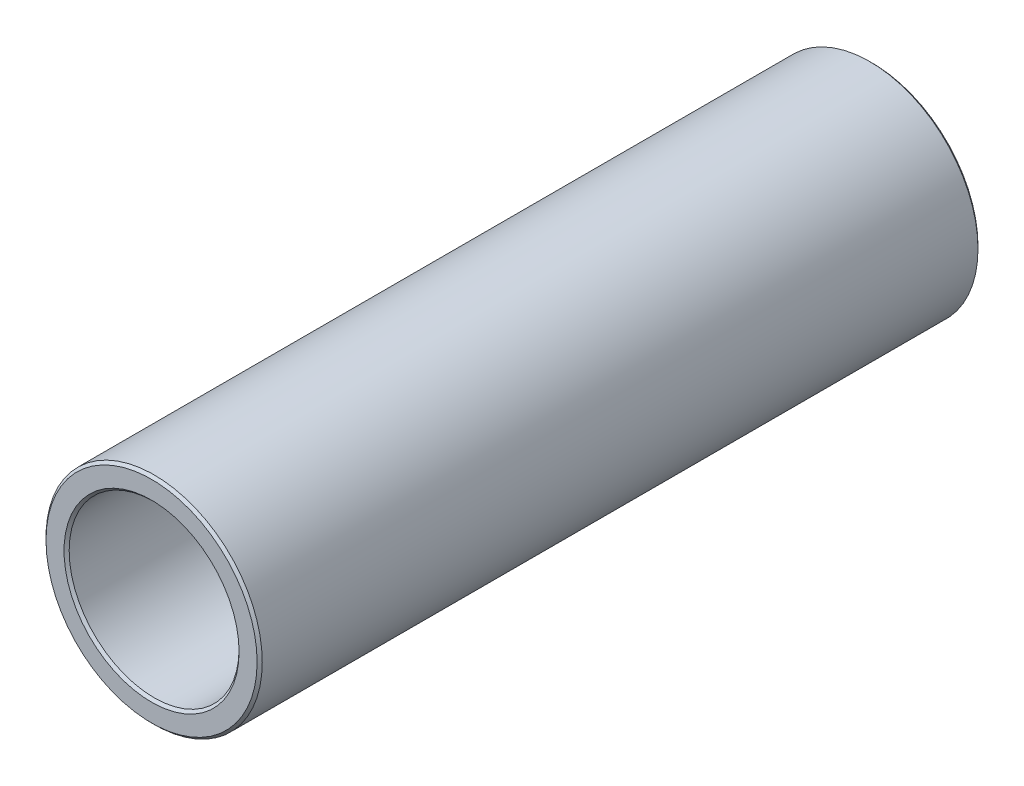
ISO-10303-21;
HEADER;
FILE_DESCRIPTION(('STEP AP214'),'2;1');
FILE_NAME('part.step','',(''),(''),'','','');
FILE_SCHEMA(('AUTOMOTIVE_DESIGN { 1 0 10303 214 1 1 1 1 }'));
ENDSEC;
DATA;
#1=APPLICATION_CONTEXT('core data for automotive mechanical design processes');
#2=APPLICATION_PROTOCOL_DEFINITION('international standard','automotive_design',2000,#1);
#3=PRODUCT_CONTEXT('',#1,'mechanical');
#4=PRODUCT('Part','Part','',(#3));
#5=PRODUCT_RELATED_PRODUCT_CATEGORY('part','',(#4));
#6=PRODUCT_DEFINITION_FORMATION('','',#4);
#7=PRODUCT_DEFINITION_CONTEXT('part definition',#1,'design');
#8=PRODUCT_DEFINITION('design','',#6,#7);
#9=PRODUCT_DEFINITION_SHAPE('','',#8);
#10=(LENGTH_UNIT() NAMED_UNIT(*) SI_UNIT(.MILLI.,.METRE.));
#11=(NAMED_UNIT(*) PLANE_ANGLE_UNIT() SI_UNIT($,.RADIAN.));
#12=(NAMED_UNIT(*) SI_UNIT($,.STERADIAN.) SOLID_ANGLE_UNIT());
#13=UNCERTAINTY_MEASURE_WITH_UNIT(LENGTH_MEASURE(1.E-05),#10,'distance_accuracy_value','');
#14=(GEOMETRIC_REPRESENTATION_CONTEXT(3) GLOBAL_UNCERTAINTY_ASSIGNED_CONTEXT((#13)) GLOBAL_UNIT_ASSIGNED_CONTEXT((#10,
#11,#12)) REPRESENTATION_CONTEXT('',''));
#15=CARTESIAN_POINT('',(0.,0.,0.));
#16=DIRECTION('',(0.,0.,1.));
#17=DIRECTION('',(1.,0.,0.));
#18=AXIS2_PLACEMENT_3D('',#15,#16,#17);
#19=CARTESIAN_POINT('',(1.2490009027033E-13,0.,140.));
#20=DIRECTION('',(0.,0.,-0.999999999999999));
#21=DIRECTION('',(-1.,0.,0.));
#22=AXIS2_PLACEMENT_3D('',#19,#20,#21);
#23=PLANE('',#22);
#24=CARTESIAN_POINT('',(1.2490009027033E-13,0.,140.));
#25=DIRECTION('',(0.,0.,0.999999999999999));
#26=DIRECTION('',(1.,0.,0.));
#27=AXIS2_PLACEMENT_3D('',#24,#25,#26);
#28=CIRCLE('',#27,20.5);
#29=CARTESIAN_POINT('',(20.5000000000001,0.,140.));
#30=VERTEX_POINT('',#29);
#31=EDGE_CURVE('E52',#30,#30,#28,.T.);
#32=ORIENTED_EDGE('',*,*,#31,.T.);
#33=EDGE_LOOP('',(#32));
#34=FACE_BOUND('',#33,.T.);
#35=CARTESIAN_POINT('',(1.2490009027033E-13,0.,140.));
#36=DIRECTION('',(0.,0.,0.999999999999999));
#37=DIRECTION('',(1.,0.,0.));
#38=AXIS2_PLACEMENT_3D('',#35,#36,#37);
#39=CIRCLE('',#38,17.);
#40=CARTESIAN_POINT('',(17.0000000000001,0.,140.));
#41=VERTEX_POINT('',#40);
#42=EDGE_CURVE('E74',#41,#41,#39,.T.);
#43=ORIENTED_EDGE('',*,*,#42,.F.);
#44=EDGE_LOOP('',(#43));
#45=FACE_BOUND('',#44,.T.);
#46=ADVANCED_FACE('F46',(#34,#45),#23,.F.);
#47=CARTESIAN_POINT('',(0.,21.0000000000001,0.));
#48=DIRECTION('',(0.,0.,0.999999999999999));
#49=DIRECTION('',(1.,0.,0.));
#50=AXIS2_PLACEMENT_3D('',#47,#48,#49);
#51=PLANE('',#50);
#52=CARTESIAN_POINT('',(0.,0.,0.));
#53=DIRECTION('',(0.,0.,0.999999999999999));
#54=DIRECTION('',(1.,0.,0.));
#55=AXIS2_PLACEMENT_3D('',#52,#53,#54);
#56=CIRCLE('',#55,20.5);
#57=CARTESIAN_POINT('',(20.5,0.,0.));
#58=VERTEX_POINT('',#57);
#59=EDGE_CURVE('E56',#58,#58,#56,.T.);
#60=ORIENTED_EDGE('',*,*,#59,.F.);
#61=EDGE_LOOP('',(#60));
#62=FACE_BOUND('',#61,.T.);
#63=CARTESIAN_POINT('',(0.,0.,0.));
#64=DIRECTION('',(0.,0.,0.999999999999999));
#65=DIRECTION('',(1.,0.,0.));
#66=AXIS2_PLACEMENT_3D('',#63,#64,#65);
#67=CIRCLE('',#66,8.);
#68=CARTESIAN_POINT('',(8.00000000000001,0.,0.));
#69=VERTEX_POINT('',#68);
#70=EDGE_CURVE('E71',#69,#69,#67,.T.);
#71=ORIENTED_EDGE('',*,*,#70,.T.);
#72=EDGE_LOOP('',(#71));
#73=FACE_BOUND('',#72,.T.);
#74=ADVANCED_FACE('F99',(#62,#73),#51,.F.);
#75=CARTESIAN_POINT('',(0.,0.,0.));
#76=DIRECTION('',(0.,0.,0.999999999999999));
#77=DIRECTION('',(1.,0.,0.));
#78=AXIS2_PLACEMENT_3D('',#75,#76,#77);
#79=CYLINDRICAL_SURFACE('',#78,21.);
#80=CARTESIAN_POINT('',(1.2490009027033E-13,0.,139.5));
#81=DIRECTION('',(0.,0.,0.999999999999999));
#82=DIRECTION('',(1.,0.,0.));
#83=AXIS2_PLACEMENT_3D('',#80,#81,#82);
#84=CIRCLE('',#83,21.);
#85=CARTESIAN_POINT('',(21.,0.,139.5));
#86=VERTEX_POINT('',#85);
#87=EDGE_CURVE('E12',#86,#86,#84,.T.);
#88=CARTESIAN_POINT('',(0.,0.,0.5));
#89=DIRECTION('',(0.,0.,0.999999999999999));
#90=DIRECTION('',(1.,0.,0.));
#91=AXIS2_PLACEMENT_3D('',#88,#89,#90);
#92=CIRCLE('',#91,21.);
#93=CARTESIAN_POINT('',(21.,0.,0.499999999999999));
#94=VERTEX_POINT('',#93);
#95=EDGE_CURVE('E60',#94,#94,#92,.T.);
#96=CARTESIAN_POINT('',(21.,0.,139.5));
#97=CARTESIAN_POINT('',(21.,0.,138.052083333333));
#98=CARTESIAN_POINT('',(21.,0.,136.604166666667));
#99=CARTESIAN_POINT('',(21.,0.,133.708333333333));
#100=CARTESIAN_POINT('',(21.,0.,132.260416666667));
#101=CARTESIAN_POINT('',(21.,0.,129.364583333333));
#102=CARTESIAN_POINT('',(21.,0.,127.916666666667));
#103=CARTESIAN_POINT('',(21.,0.,125.020833333333));
#104=CARTESIAN_POINT('',(21.,0.,123.572916666667));
#105=CARTESIAN_POINT('',(21.,0.,120.677083333333));
#106=CARTESIAN_POINT('',(21.,0.,119.229166666667));
#107=CARTESIAN_POINT('',(21.,0.,116.333333333333));
#108=CARTESIAN_POINT('',(21.,0.,114.885416666667));
#109=CARTESIAN_POINT('',(21.,0.,111.989583333333));
#110=CARTESIAN_POINT('',(21.,0.,110.541666666667));
#111=CARTESIAN_POINT('',(21.,0.,107.645833333333));
#112=CARTESIAN_POINT('',(21.,0.,106.197916666667));
#113=CARTESIAN_POINT('',(21.,0.,103.302083333333));
#114=CARTESIAN_POINT('',(21.,0.,101.854166666667));
#115=CARTESIAN_POINT('',(21.,0.,98.9583333333333));
#116=CARTESIAN_POINT('',(21.,0.,97.5104166666666));
#117=CARTESIAN_POINT('',(21.,0.,94.6145833333333));
#118=CARTESIAN_POINT('',(21.,0.,93.1666666666666));
#119=CARTESIAN_POINT('',(21.,0.,90.2708333333333));
#120=CARTESIAN_POINT('',(21.,0.,88.8229166666666));
#121=CARTESIAN_POINT('',(21.,0.,85.9270833333333));
#122=CARTESIAN_POINT('',(21.,0.,84.4791666666666));
#123=CARTESIAN_POINT('',(21.,0.,81.5833333333333));
#124=CARTESIAN_POINT('',(21.,0.,80.1354166666666));
#125=CARTESIAN_POINT('',(21.,0.,77.2395833333333));
#126=CARTESIAN_POINT('',(21.,0.,75.7916666666666));
#127=CARTESIAN_POINT('',(21.,0.,72.8958333333333));
#128=CARTESIAN_POINT('',(21.,0.,71.4479166666666));
#129=CARTESIAN_POINT('',(21.,0.,68.5520833333333));
#130=CARTESIAN_POINT('',(21.,0.,67.1041666666666));
#131=CARTESIAN_POINT('',(21.,0.,64.2083333333333));
#132=CARTESIAN_POINT('',(21.,0.,62.7604166666666));
#133=CARTESIAN_POINT('',(21.,0.,59.8645833333333));
#134=CARTESIAN_POINT('',(21.,0.,58.4166666666666));
#135=CARTESIAN_POINT('',(21.,0.,55.5208333333333));
#136=CARTESIAN_POINT('',(21.,0.,54.0729166666666));
#137=CARTESIAN_POINT('',(21.,0.,51.1770833333333));
#138=CARTESIAN_POINT('',(21.,0.,49.7291666666666));
#139=CARTESIAN_POINT('',(21.,0.,46.8333333333333));
#140=CARTESIAN_POINT('',(21.,0.,45.3854166666666));
#141=CARTESIAN_POINT('',(21.,0.,42.4895833333333));
#142=CARTESIAN_POINT('',(21.,0.,41.0416666666667));
#143=CARTESIAN_POINT('',(21.,0.,38.1458333333333));
#144=CARTESIAN_POINT('',(21.,0.,36.6979166666667));
#145=CARTESIAN_POINT('',(21.,0.,33.8020833333333));
#146=CARTESIAN_POINT('',(21.,0.,32.3541666666666));
#147=CARTESIAN_POINT('',(21.,0.,29.4583333333333));
#148=CARTESIAN_POINT('',(21.,0.,28.0104166666667));
#149=CARTESIAN_POINT('',(21.,0.,25.1145833333333));
#150=CARTESIAN_POINT('',(21.,0.,23.6666666666667));
#151=CARTESIAN_POINT('',(21.,0.,20.7708333333333));
#152=CARTESIAN_POINT('',(21.,0.,19.3229166666667));
#153=CARTESIAN_POINT('',(21.,0.,16.4270833333333));
#154=CARTESIAN_POINT('',(21.,0.,14.9791666666667));
#155=CARTESIAN_POINT('',(21.,0.,12.0833333333333));
#156=CARTESIAN_POINT('',(21.,0.,10.6354166666667));
#157=CARTESIAN_POINT('',(21.,0.,7.73958333333334));
#158=CARTESIAN_POINT('',(21.,0.,6.29166666666667));
#159=CARTESIAN_POINT('',(21.,0.,3.39583333333334));
#160=CARTESIAN_POINT('',(21.,0.,1.94791666666667));
#161=CARTESIAN_POINT('',(21.,0.,0.500000000000001));
#162=B_SPLINE_CURVE_WITH_KNOTS('',3,(#96,#97,#98,#99,#100,#101,#102,#103,#104,#105,#106,#107,
#108,#109,#110,#111,#112,#113,#114,#115,#116,#117,#118,#119,#120,#121,#122,#123,#124,#125,#126,
#127,#128,#129,#130,#131,#132,#133,#134,#135,#136,#137,#138,#139,#140,#141,#142,#143,#144,#145,
#146,#147,#148,#149,#150,#151,#152,#153,#154,#155,#156,#157,#158,#159,#160,#161),.UNSPECIFIED.,
.F.,.F.,(4,2,2,2,2,2,2,2,2,2,2,2,2,2,2,2,2,2,2,2,2,2,2,2,2,2,2,2,2,2,2,2,4),(0.,
4.34375000000001,8.68750000000001,13.03125,17.375,21.71875,26.0625,30.40625,34.75,39.09375,
43.4375,47.78125,52.125,56.46875,60.8125,65.15625,69.5,73.84375,78.1875,82.5312499999999,86.875,
91.21875,95.5624999999999,99.9062499999999,104.25,108.59375,112.9375,117.28125,121.625,
125.96875,130.3125,134.65625,139.),.UNSPECIFIED.);
#163=EDGE_CURVE('BSEAM103',#86,#94,#162,.T.);
#164=ORIENTED_EDGE('',*,*,#87,.F.);
#165=ORIENTED_EDGE('',*,*,#95,.T.);
#166=ORIENTED_EDGE('',*,*,#163,.T.);
#167=ORIENTED_EDGE('',*,*,#163,.F.);
#168=EDGE_LOOP('',(#164,#166,#165,#167));
#169=FACE_BOUND('',#168,.T.);
#170=ADVANCED_FACE('F103',(#169),#79,.T.);
#171=CARTESIAN_POINT('',(1.2490009027033E-13,0.,140.));
#172=DIRECTION('',(0.,0.,-0.999999999999999));
#173=DIRECTION('',(-1.,0.,0.));
#174=AXIS2_PLACEMENT_3D('',#171,#172,#173);
#175=CONICAL_SURFACE('',#174,20.5,0.785398163397448);
#176=ORIENTED_EDGE('',*,*,#87,.T.);
#177=EDGE_LOOP('',(#176));
#178=FACE_BOUND('',#177,.T.);
#179=ORIENTED_EDGE('',*,*,#31,.F.);
#180=EDGE_LOOP('',(#179));
#181=FACE_BOUND('',#180,.T.);
#182=ADVANCED_FACE('F113',(#178,#181),#175,.T.);
#183=CARTESIAN_POINT('',(0.,0.,0.5));
#184=DIRECTION('',(0.,0.,0.999999999999999));
#185=DIRECTION('',(1.,0.,0.));
#186=AXIS2_PLACEMENT_3D('',#183,#184,#185);
#187=CONICAL_SURFACE('',#186,21.,0.785398163397449);
#188=CARTESIAN_POINT('',(20.5,0.,0.));
#189=CARTESIAN_POINT('',(20.5052083333333,0.,0.0052083333333314));
#190=CARTESIAN_POINT('',(20.5104166666667,0.,0.0104166666666651));
#191=CARTESIAN_POINT('',(20.5208333333333,0.,0.0208333333333324));
#192=CARTESIAN_POINT('',(20.5260416666667,0.,0.0260416666666661));
#193=CARTESIAN_POINT('',(20.5364583333333,0.,0.0364583333333326));
#194=CARTESIAN_POINT('',(20.5416666666667,0.,0.0416666666666654));
#195=CARTESIAN_POINT('',(20.5520833333333,0.,0.0520833333333321));
#196=CARTESIAN_POINT('',(20.5572916666667,0.,0.057291666666666));
#197=CARTESIAN_POINT('',(20.5677083333333,0.,0.0677083333333326));
#198=CARTESIAN_POINT('',(20.5729166666667,0.,0.0729166666666654));
#199=CARTESIAN_POINT('',(20.5833333333333,0.,0.0833333333333321));
#200=CARTESIAN_POINT('',(20.5885416666667,0.,0.088541666666666));
#201=CARTESIAN_POINT('',(20.5989583333333,0.,0.0989583333333327));
#202=CARTESIAN_POINT('',(20.6041666666667,0.,0.104166666666665));
#203=CARTESIAN_POINT('',(20.6145833333333,0.,0.114583333333332));
#204=CARTESIAN_POINT('',(20.6197916666667,0.,0.119791666666666));
#205=CARTESIAN_POINT('',(20.6302083333333,0.,0.130208333333333));
#206=CARTESIAN_POINT('',(20.6354166666667,0.,0.135416666666665));
#207=CARTESIAN_POINT('',(20.6458333333333,0.,0.145833333333332));
#208=CARTESIAN_POINT('',(20.6510416666667,0.,0.151041666666666));
#209=CARTESIAN_POINT('',(20.6614583333333,0.,0.161458333333333));
#210=CARTESIAN_POINT('',(20.6666666666667,0.,0.166666666666666));
#211=CARTESIAN_POINT('',(20.6770833333333,0.,0.177083333333332));
#212=CARTESIAN_POINT('',(20.6822916666667,0.,0.182291666666666));
#213=CARTESIAN_POINT('',(20.6927083333333,0.,0.192708333333333));
#214=CARTESIAN_POINT('',(20.6979166666667,0.,0.197916666666666));
#215=CARTESIAN_POINT('',(20.7083333333333,0.,0.208333333333332));
#216=CARTESIAN_POINT('',(20.7135416666667,0.,0.213541666666666));
#217=CARTESIAN_POINT('',(20.7239583333333,0.,0.223958333333333));
#218=CARTESIAN_POINT('',(20.7291666666667,0.,0.229166666666666));
#219=CARTESIAN_POINT('',(20.7395833333333,0.,0.239583333333332));
#220=CARTESIAN_POINT('',(20.7447916666667,0.,0.244791666666666));
#221=CARTESIAN_POINT('',(20.7552083333333,0.,0.255208333333333));
#222=CARTESIAN_POINT('',(20.7604166666667,0.,0.260416666666666));
#223=CARTESIAN_POINT('',(20.7708333333333,0.,0.270833333333332));
#224=CARTESIAN_POINT('',(20.7760416666667,0.,0.276041666666666));
#225=CARTESIAN_POINT('',(20.7864583333333,0.,0.286458333333333));
#226=CARTESIAN_POINT('',(20.7916666666667,0.,0.291666666666666));
#227=CARTESIAN_POINT('',(20.8020833333333,0.,0.302083333333332));
#228=CARTESIAN_POINT('',(20.8072916666667,0.,0.307291666666666));
#229=CARTESIAN_POINT('',(20.8177083333333,0.,0.317708333333333));
#230=CARTESIAN_POINT('',(20.8229166666667,0.,0.322916666666666));
#231=CARTESIAN_POINT('',(20.8333333333333,0.,0.333333333333332));
#232=CARTESIAN_POINT('',(20.8385416666667,0.,0.338541666666666));
#233=CARTESIAN_POINT('',(20.8489583333333,0.,0.348958333333333));
#234=CARTESIAN_POINT('',(20.8541666666667,0.,0.354166666666666));
#235=CARTESIAN_POINT('',(20.8645833333333,0.,0.364583333333332));
#236=CARTESIAN_POINT('',(20.8697916666667,0.,0.369791666666666));
#237=CARTESIAN_POINT('',(20.8802083333333,0.,0.380208333333333));
#238=CARTESIAN_POINT('',(20.8854166666667,0.,0.385416666666666));
#239=CARTESIAN_POINT('',(20.8958333333333,0.,0.395833333333332));
#240=CARTESIAN_POINT('',(20.9010416666667,0.,0.401041666666666));
#241=CARTESIAN_POINT('',(20.9114583333333,0.,0.411458333333333));
#242=CARTESIAN_POINT('',(20.9166666666667,0.,0.416666666666666));
#243=CARTESIAN_POINT('',(20.9270833333333,0.,0.427083333333332));
#244=CARTESIAN_POINT('',(20.9322916666667,0.,0.432291666666666));
#245=CARTESIAN_POINT('',(20.9427083333333,0.,0.442708333333333));
#246=CARTESIAN_POINT('',(20.9479166666667,0.,0.447916666666666));
#247=CARTESIAN_POINT('',(20.9583333333333,0.,0.458333333333332));
#248=CARTESIAN_POINT('',(20.9635416666667,0.,0.463541666666666));
#249=CARTESIAN_POINT('',(20.9739583333333,0.,0.473958333333333));
#250=CARTESIAN_POINT('',(20.9791666666667,0.,0.479166666666666));
#251=CARTESIAN_POINT('',(20.9895833333333,0.,0.489583333333332));
#252=CARTESIAN_POINT('',(20.9947916666667,0.,0.494791666666665));
#253=CARTESIAN_POINT('',(21.,0.,0.499999999999999));
#254=B_SPLINE_CURVE_WITH_KNOTS('',3,(#188,#189,#190,#191,#192,#193,#194,#195,#196,#197,#198,
#199,#200,#201,#202,#203,#204,#205,#206,#207,#208,#209,#210,#211,#212,#213,#214,#215,#216,#217,
#218,#219,#220,#221,#222,#223,#224,#225,#226,#227,#228,#229,#230,#231,#232,#233,#234,#235,#236,
#237,#238,#239,#240,#241,#242,#243,#244,#245,#246,#247,#248,#249,#250,#251,#252,#253),
.UNSPECIFIED.,.F.,.F.,(4,2,2,2,2,2,2,2,2,2,2,2,2,2,2,2,2,2,2,2,2,2,2,2,2,2,2,2,2,2,2,2,4),(0.,
0.0220970869120809,0.0441941738241593,0.0662912607362401,0.0883883476483185,0.110485434560399,
0.132582521472478,0.154679608384559,0.176776695296637,0.198873782208718,0.220970869120796,
0.243067956032877,0.265165042944956,0.287262129857036,0.309359216769115,0.331456303681196,
0.353553390593274,0.375650477505355,0.397747564417433,0.419844651329514,0.441941738241592,
0.464038825153673,0.486135912065752,0.508232998977832,0.530330085889911,0.552427172801992,
0.57452425971407,0.596621346626151,0.61871843353823,0.64081552045031,0.662912607362389,
0.685009694274469,0.707106781186548),.UNSPECIFIED.);
#255=EDGE_CURVE('BSEAM120',#58,#94,#254,.T.);
#256=ORIENTED_EDGE('',*,*,#59,.T.);
#257=ORIENTED_EDGE('',*,*,#95,.F.);
#258=ORIENTED_EDGE('',*,*,#255,.T.);
#259=ORIENTED_EDGE('',*,*,#255,.F.);
#260=EDGE_LOOP('',(#256,#258,#257,#259));
#261=FACE_BOUND('',#260,.T.);
#262=ADVANCED_FACE('F120',(#261),#187,.T.);
#263=CARTESIAN_POINT('',(1.11022302462516E-13,-1.11022302462516E-13,11.9175));
#264=DIRECTION('',(0.,0.,0.999999999999999));
#265=DIRECTION('',(1.,0.,0.));
#266=AXIS2_PLACEMENT_3D('',#263,#264,#265);
#267=CONICAL_SURFACE('',#266,6.9175,1.45830687177095);
#268=CARTESIAN_POINT('',(1.11022302462516E-13,-1.11022302462516E-13,13.));
#269=DIRECTION('',(0.,0.,0.999999999999999));
#270=DIRECTION('',(1.,0.,0.));
#271=AXIS2_PLACEMENT_3D('',#268,#269,#270);
#272=CIRCLE('',#271,16.5);
#273=CARTESIAN_POINT('',(16.5,-1.09189152578439E-13,13.));
#274=VERTEX_POINT('',#273);
#275=EDGE_CURVE('E80',#274,#274,#272,.T.);
#276=CARTESIAN_POINT('',(1.11022302462516E-13,-1.11022302462516E-13,11.9175));
#277=DIRECTION('',(0.,0.,0.999999999999999));
#278=DIRECTION('',(1.,0.,0.));
#279=AXIS2_PLACEMENT_3D('',#276,#277,#278);
#280=CIRCLE('',#279,6.9175);
#281=CARTESIAN_POINT('',(6.91750000000011,-1.10254305685231E-13,11.9175));
#282=VERTEX_POINT('',#281);
#283=EDGE_CURVE('E65',#282,#282,#280,.T.);
#284=CARTESIAN_POINT('',(16.5,-1.09189152578439E-13,13.));
#285=CARTESIAN_POINT('',(16.4001822916667,-1.09200247923301E-13,12.9887239583333));
#286=CARTESIAN_POINT('',(16.3003645833333,-1.09211343268164E-13,12.9774479166667));
#287=CARTESIAN_POINT('',(16.1007291666667,-1.09233533957888E-13,12.9548958333333));
#288=CARTESIAN_POINT('',(16.0009114583333,-1.09244629302751E-13,12.9436197916667));
#289=CARTESIAN_POINT('',(15.8012760416667,-1.09266819992476E-13,12.9210677083333));
#290=CARTESIAN_POINT('',(15.7014583333333,-1.09277915337338E-13,12.9097916666667));
#291=CARTESIAN_POINT('',(15.5018229166667,-1.09300106027063E-13,12.8872395833333));
#292=CARTESIAN_POINT('',(15.4020052083333,-1.09311201371925E-13,12.8759635416667));
#293=CARTESIAN_POINT('',(15.2023697916667,-1.0933339206165E-13,12.8534114583333));
#294=CARTESIAN_POINT('',(15.1025520833333,-1.09344487406513E-13,12.8421354166667));
#295=CARTESIAN_POINT('',(14.9029166666667,-1.09366678096237E-13,12.8195833333333));
#296=CARTESIAN_POINT('',(14.8030989583334,-1.093777734411E-13,12.8083072916667));
#297=CARTESIAN_POINT('',(14.6034635416667,-1.09399964130825E-13,12.7857552083333));
#298=CARTESIAN_POINT('',(14.5036458333334,-1.09411059475687E-13,12.7744791666667));
#299=CARTESIAN_POINT('',(14.3040104166667,-1.09433250165412E-13,12.7519270833333));
#300=CARTESIAN_POINT('',(14.2041927083334,-1.09444345510274E-13,12.7406510416667));
#301=CARTESIAN_POINT('',(14.0045572916667,-1.09466536199999E-13,12.7180989583333));
#302=CARTESIAN_POINT('',(13.9047395833334,-1.09477631544862E-13,12.7068229166667));
#303=CARTESIAN_POINT('',(13.7051041666667,-1.09499822234587E-13,12.6842708333333));
#304=CARTESIAN_POINT('',(13.6052864583334,-1.09510917579449E-13,12.6729947916667));
#305=CARTESIAN_POINT('',(13.4056510416667,-1.09533108269174E-13,12.6504427083333));
#306=CARTESIAN_POINT('',(13.3058333333334,-1.09544203614036E-13,12.6391666666667));
#307=CARTESIAN_POINT('',(13.1061979166667,-1.09566394303761E-13,12.6166145833333));
#308=CARTESIAN_POINT('',(13.0063802083334,-1.09577489648623E-13,12.6053385416667));
#309=CARTESIAN_POINT('',(12.8067447916667,-1.09599680338348E-13,12.5827864583333));
#310=CARTESIAN_POINT('',(12.7069270833334,-1.09610775683211E-13,12.5715104166667));
#311=CARTESIAN_POINT('',(12.5072916666667,-1.09632966372936E-13,12.5489583333333));
#312=CARTESIAN_POINT('',(12.4074739583334,-1.09644061717798E-13,12.5376822916667));
#313=CARTESIAN_POINT('',(12.2078385416667,-1.09666252407523E-13,12.5151302083333));
#314=CARTESIAN_POINT('',(12.1080208333334,-1.09677347752385E-13,12.5038541666667));
#315=CARTESIAN_POINT('',(11.9083854166667,-1.0969953844211E-13,12.4813020833334));
#316=CARTESIAN_POINT('',(11.8085677083334,-1.09710633786973E-13,12.4700260416667));
#317=CARTESIAN_POINT('',(11.6089322916667,-1.09732824476697E-13,12.4474739583334));
#318=CARTESIAN_POINT('',(11.5091145833334,-1.0974391982156E-13,12.4361979166667));
#319=CARTESIAN_POINT('',(11.3094791666667,-1.09766110511285E-13,12.4136458333334));
#320=CARTESIAN_POINT('',(11.2096614583334,-1.09777205856147E-13,12.4023697916667));
#321=CARTESIAN_POINT('',(11.0100260416667,-1.09799396545872E-13,12.3798177083334));
#322=CARTESIAN_POINT('',(10.9102083333334,-1.09810491890734E-13,12.3685416666667));
#323=CARTESIAN_POINT('',(10.7105729166667,-1.09832682580459E-13,12.3459895833334));
#324=CARTESIAN_POINT('',(10.6107552083334,-1.09843777925322E-13,12.3347135416667));
#325=CARTESIAN_POINT('',(10.4111197916667,-1.09865968615046E-13,12.3121614583334));
#326=CARTESIAN_POINT('',(10.3113020833334,-1.09877063959909E-13,12.3008854166667));
#327=CARTESIAN_POINT('',(10.1116666666667,-1.09899254649634E-13,12.2783333333334));
#328=CARTESIAN_POINT('',(10.0118489583334,-1.09910349994496E-13,12.2670572916667));
#329=CARTESIAN_POINT('',(9.81221354166674,-1.09932540684221E-13,12.2445052083334));
#330=CARTESIAN_POINT('',(9.71239583333341,-1.09943636029083E-13,12.2332291666667));
#331=CARTESIAN_POINT('',(9.51276041666675,-1.09965826718808E-13,12.2106770833334));
#332=CARTESIAN_POINT('',(9.41294270833341,-1.09976922063671E-13,12.1994010416667));
#333=CARTESIAN_POINT('',(9.21330729166675,-1.09999112753395E-13,12.1768489583334));
#334=CARTESIAN_POINT('',(9.11348958333342,-1.10010208098258E-13,12.1655729166667));
#335=CARTESIAN_POINT('',(8.91385416666675,-1.10032398787983E-13,12.1430208333334));
#336=CARTESIAN_POINT('',(8.81403645833342,-1.10043494132845E-13,12.1317447916667));
#337=CARTESIAN_POINT('',(8.61440104166676,-1.1006568482257E-13,12.1091927083334));
#338=CARTESIAN_POINT('',(8.51458333333342,-1.10076780167432E-13,12.0979166666667));
#339=CARTESIAN_POINT('',(8.31494791666676,-1.10098970857157E-13,12.0753645833334));
#340=CARTESIAN_POINT('',(8.21513020833343,-1.1011006620202E-13,12.0640885416667));
#341=CARTESIAN_POINT('',(8.01549479166676,-1.10132256891745E-13,12.0415364583334));
#342=CARTESIAN_POINT('',(7.91567708333343,-1.10143352236607E-13,12.0302604166667));
#343=CARTESIAN_POINT('',(7.71604166666677,-1.10165542926332E-13,12.0077083333334));
#344=CARTESIAN_POINT('',(7.61622395833343,-1.10176638271194E-13,11.9964322916667));
#345=CARTESIAN_POINT('',(7.41658854166677,-1.10198828960919E-13,11.9738802083334));
#346=CARTESIAN_POINT('',(7.31677083333344,-1.10209924305782E-13,11.9626041666667));
#347=CARTESIAN_POINT('',(7.11713541666677,-1.10232114995506E-13,11.9400520833334));
#348=CARTESIAN_POINT('',(7.01731770833344,-1.10243210340369E-13,11.9287760416667));
#349=CARTESIAN_POINT('',(6.91750000000011,-1.10254305685231E-13,11.9175));
#350=B_SPLINE_CURVE_WITH_KNOTS('',3,(#284,#285,#286,#287,#288,#289,#290,#291,#292,#293,#294,
#295,#296,#297,#298,#299,#300,#301,#302,#303,#304,#305,#306,#307,#308,#309,#310,#311,#312,#313,
#314,#315,#316,#317,#318,#319,#320,#321,#322,#323,#324,#325,#326,#327,#328,#329,#330,#331,#332,
#333,#334,#335,#336,#337,#338,#339,#340,#341,#342,#343,#344,#345,#346,#347,#348,#349),
.UNSPECIFIED.,.F.,.F.,(4,2,2,2,2,2,2,2,2,2,2,2,2,2,2,2,2,2,2,2,2,2,2,2,2,2,2,2,2,2,2,2,4),(0.,
0.301357787543777,0.60271557508755,0.904073362631323,1.2054311501751,1.50678893771887,
1.80814672526265,2.10950451280642,2.4108623003502,2.71222008789398,3.01357787543775,
3.31493566298153,3.6162934505253,3.91765123806908,4.21900902561285,4.52036681315663,
4.8217246007004,5.12308238824418,5.42444017578795,5.72579796333173,6.02715575087551,
6.32851353841928,6.62987132596306,6.93122911350683,7.23258690105061,7.53394468859438,
7.83530247613816,8.13666026368193,8.43801805122571,8.73937583876948,9.04073362631326,
9.34209141385704,9.64344920140081),.UNSPECIFIED.);
#351=EDGE_CURVE('BSEAM84',#274,#282,#350,.T.);
#352=ORIENTED_EDGE('',*,*,#275,.T.);
#353=ORIENTED_EDGE('',*,*,#283,.F.);
#354=ORIENTED_EDGE('',*,*,#351,.T.);
#355=ORIENTED_EDGE('',*,*,#351,.F.);
#356=EDGE_LOOP('',(#352,#354,#353,#355));
#357=FACE_BOUND('',#356,.T.);
#358=ADVANCED_FACE('F84',(#357),#267,.F.);
#359=CARTESIAN_POINT('',(0.,0.,0.));
#360=DIRECTION('',(0.,0.,0.999999999999999));
#361=DIRECTION('',(1.,0.,0.));
#362=AXIS2_PLACEMENT_3D('',#359,#360,#361);
#363=CYLINDRICAL_SURFACE('',#362,6.9175);
#364=CARTESIAN_POINT('',(0.,0.,1.08249999999999));
#365=DIRECTION('',(0.,0.,0.999999999999999));
#366=DIRECTION('',(1.,0.,0.));
#367=AXIS2_PLACEMENT_3D('',#364,#365,#366);
#368=CIRCLE('',#367,6.9175);
#369=CARTESIAN_POINT('',(6.9175,0.,1.08249999999999));
#370=VERTEX_POINT('',#369);
#371=EDGE_CURVE('E68',#370,#370,#368,.T.);
#372=CARTESIAN_POINT('',(6.91750000000001,0.,11.9175));
#373=CARTESIAN_POINT('',(6.91750000000001,0.,11.8046354166667));
#374=CARTESIAN_POINT('',(6.91750000000001,0.,11.6917708333334));
#375=CARTESIAN_POINT('',(6.91750000000001,0.,11.4660416666667));
#376=CARTESIAN_POINT('',(6.91750000000001,0.,11.3531770833334));
#377=CARTESIAN_POINT('',(6.91750000000001,0.,11.1274479166667));
#378=CARTESIAN_POINT('',(6.91750000000001,0.,11.0145833333334));
#379=CARTESIAN_POINT('',(6.91750000000001,0.,10.7888541666667));
#380=CARTESIAN_POINT('',(6.91750000000001,0.,10.6759895833334));
#381=CARTESIAN_POINT('',(6.91750000000001,0.,10.4502604166667));
#382=CARTESIAN_POINT('',(6.91750000000001,0.,10.3373958333334));
#383=CARTESIAN_POINT('',(6.91750000000001,0.,10.1116666666667));
#384=CARTESIAN_POINT('',(6.91750000000001,0.,9.99880208333335));
#385=CARTESIAN_POINT('',(6.91750000000001,0.,9.77307291666668));
#386=CARTESIAN_POINT('',(6.91750000000001,0.,9.66020833333335));
#387=CARTESIAN_POINT('',(6.91750000000001,0.,9.43447916666668));
#388=CARTESIAN_POINT('',(6.91750000000001,0.,9.32161458333335));
#389=CARTESIAN_POINT('',(6.91750000000001,0.,9.09588541666668));
#390=CARTESIAN_POINT('',(6.91750000000001,0.,8.98302083333335));
#391=CARTESIAN_POINT('',(6.91750000000001,0.,8.75729166666668));
#392=CARTESIAN_POINT('',(6.91750000000001,0.,8.64442708333335));
#393=CARTESIAN_POINT('',(6.91750000000001,0.,8.41869791666668));
#394=CARTESIAN_POINT('',(6.9175,0.,8.30583333333334));
#395=CARTESIAN_POINT('',(6.9175,0.,8.08010416666668));
#396=CARTESIAN_POINT('',(6.9175,0.,7.96723958333334));
#397=CARTESIAN_POINT('',(6.9175,0.,7.74151041666668));
#398=CARTESIAN_POINT('',(6.9175,0.,7.62864583333334));
#399=CARTESIAN_POINT('',(6.9175,0.,7.40291666666668));
#400=CARTESIAN_POINT('',(6.9175,0.,7.29005208333334));
#401=CARTESIAN_POINT('',(6.9175,0.,7.06432291666667));
#402=CARTESIAN_POINT('',(6.9175,0.,6.95145833333334));
#403=CARTESIAN_POINT('',(6.9175,0.,6.72572916666667));
#404=CARTESIAN_POINT('',(6.9175,0.,6.61286458333334));
#405=CARTESIAN_POINT('',(6.9175,0.,6.38713541666667));
#406=CARTESIAN_POINT('',(6.9175,0.,6.27427083333334));
#407=CARTESIAN_POINT('',(6.9175,0.,6.04854166666667));
#408=CARTESIAN_POINT('',(6.9175,0.,5.93567708333334));
#409=CARTESIAN_POINT('',(6.9175,0.,5.70994791666667));
#410=CARTESIAN_POINT('',(6.9175,0.,5.59708333333333));
#411=CARTESIAN_POINT('',(6.9175,0.,5.37135416666667));
#412=CARTESIAN_POINT('',(6.9175,0.,5.25848958333333));
#413=CARTESIAN_POINT('',(6.9175,0.,5.03276041666667));
#414=CARTESIAN_POINT('',(6.9175,0.,4.91989583333333));
#415=CARTESIAN_POINT('',(6.9175,0.,4.69416666666667));
#416=CARTESIAN_POINT('',(6.9175,0.,4.58130208333333));
#417=CARTESIAN_POINT('',(6.9175,0.,4.35557291666666));
#418=CARTESIAN_POINT('',(6.9175,0.,4.24270833333333));
#419=CARTESIAN_POINT('',(6.9175,0.,4.01697916666666));
#420=CARTESIAN_POINT('',(6.9175,0.,3.90411458333333));
#421=CARTESIAN_POINT('',(6.9175,0.,3.67838541666666));
#422=CARTESIAN_POINT('',(6.9175,0.,3.56552083333333));
#423=CARTESIAN_POINT('',(6.9175,0.,3.33979166666666));
#424=CARTESIAN_POINT('',(6.9175,0.,3.22692708333333));
#425=CARTESIAN_POINT('',(6.9175,0.,3.00119791666666));
#426=CARTESIAN_POINT('',(6.9175,0.,2.88833333333333));
#427=CARTESIAN_POINT('',(6.9175,0.,2.66260416666666));
#428=CARTESIAN_POINT('',(6.9175,0.,2.54973958333332));
#429=CARTESIAN_POINT('',(6.9175,0.,2.32401041666666));
#430=CARTESIAN_POINT('',(6.9175,0.,2.21114583333332));
#431=CARTESIAN_POINT('',(6.9175,0.,1.98541666666666));
#432=CARTESIAN_POINT('',(6.9175,0.,1.87255208333332));
#433=CARTESIAN_POINT('',(6.9175,0.,1.64682291666665));
#434=CARTESIAN_POINT('',(6.9175,0.,1.53395833333332));
#435=CARTESIAN_POINT('',(6.9175,0.,1.30822916666665));
#436=CARTESIAN_POINT('',(6.9175,0.,1.19536458333332));
#437=CARTESIAN_POINT('',(6.9175,0.,1.08249999999999));
#438=B_SPLINE_CURVE_WITH_KNOTS('',3,(#372,#373,#374,#375,#376,#377,#378,#379,#380,#381,#382,
#383,#384,#385,#386,#387,#388,#389,#390,#391,#392,#393,#394,#395,#396,#397,#398,#399,#400,#401,
#402,#403,#404,#405,#406,#407,#408,#409,#410,#411,#412,#413,#414,#415,#416,#417,#418,#419,#420,
#421,#422,#423,#424,#425,#426,#427,#428,#429,#430,#431,#432,#433,#434,#435,#436,#437),
.UNSPECIFIED.,.F.,.F.,(4,2,2,2,2,2,2,2,2,2,2,2,2,2,2,2,2,2,2,2,2,2,2,2,2,2,2,2,2,2,2,2,4),(0.,
0.338593749999999,0.677187500000001,1.01578125,1.354375,1.69296875000001,2.03156250000001,
2.37015625000001,2.70875000000001,3.04734375000001,3.38593750000001,3.72453125000001,
4.06312500000001,4.40171875000001,4.74031250000002,5.07890625000002,5.41750000000002,
5.75609375000002,6.09468750000002,6.43328125000002,6.77187500000002,7.11046875000002,
7.44906250000003,7.78765625000003,8.12625000000003,8.46484375000003,8.80343750000003,
9.14203125000003,9.48062500000003,9.81921875000003,10.1578125,10.49640625,10.835),.UNSPECIFIED.);
#439=EDGE_CURVE('BSEAM126',#282,#370,#438,.T.);
#440=ORIENTED_EDGE('',*,*,#283,.T.);
#441=ORIENTED_EDGE('',*,*,#371,.F.);
#442=ORIENTED_EDGE('',*,*,#439,.T.);
#443=ORIENTED_EDGE('',*,*,#439,.F.);
#444=EDGE_LOOP('',(#440,#442,#441,#443));
#445=FACE_BOUND('',#444,.T.);
#446=ADVANCED_FACE('F126',(#445),#363,.F.);
#447=CARTESIAN_POINT('',(0.,0.,0.));
#448=DIRECTION('',(0.,0.,-0.999999999999999));
#449=DIRECTION('',(-1.,0.,0.));
#450=AXIS2_PLACEMENT_3D('',#447,#448,#449);
#451=CONICAL_SURFACE('',#450,8.,0.785398163397448);
#452=ORIENTED_EDGE('',*,*,#371,.T.);
#453=EDGE_LOOP('',(#452));
#454=FACE_BOUND('',#453,.T.);
#455=ORIENTED_EDGE('',*,*,#70,.F.);
#456=EDGE_LOOP('',(#455));
#457=FACE_BOUND('',#456,.T.);
#458=ADVANCED_FACE('F95',(#454,#457),#451,.F.);
#459=CARTESIAN_POINT('',(1.2490009027033E-13,0.,139.5));
#460=DIRECTION('',(0.,0.,0.999999999999999));
#461=DIRECTION('',(1.,0.,0.));
#462=AXIS2_PLACEMENT_3D('',#459,#460,#461);
#463=CONICAL_SURFACE('',#462,16.5,0.785398163397448);
#464=CARTESIAN_POINT('',(1.2490009027033E-13,0.,139.5));
#465=DIRECTION('',(0.,0.,0.999999999999999));
#466=DIRECTION('',(1.,0.,0.));
#467=AXIS2_PLACEMENT_3D('',#464,#465,#466);
#468=CIRCLE('',#467,16.5);
#469=CARTESIAN_POINT('',(16.5000000000001,0.,139.5));
#470=VERTEX_POINT('',#469);
#471=EDGE_CURVE('E77',#470,#470,#468,.T.);
#472=CARTESIAN_POINT('',(17.0000000000001,0.,140.));
#473=CARTESIAN_POINT('',(16.9947916666668,0.,139.994791666667));
#474=CARTESIAN_POINT('',(16.9895833333335,0.,139.989583333333));
#475=CARTESIAN_POINT('',(16.9791666666668,0.,139.979166666667));
#476=CARTESIAN_POINT('',(16.9739583333335,0.,139.973958333333));
#477=CARTESIAN_POINT('',(16.9635416666668,0.,139.963541666667));
#478=CARTESIAN_POINT('',(16.9583333333335,0.,139.958333333333));
#479=CARTESIAN_POINT('',(16.9479166666668,0.,139.947916666667));
#480=CARTESIAN_POINT('',(16.9427083333335,0.,139.942708333333));
#481=CARTESIAN_POINT('',(16.9322916666668,0.,139.932291666667));
#482=CARTESIAN_POINT('',(16.9270833333335,0.,139.927083333333));
#483=CARTESIAN_POINT('',(16.9166666666668,0.,139.916666666667));
#484=CARTESIAN_POINT('',(16.9114583333335,0.,139.911458333333));
#485=CARTESIAN_POINT('',(16.9010416666668,0.,139.901041666667));
#486=CARTESIAN_POINT('',(16.8958333333335,0.,139.895833333333));
#487=CARTESIAN_POINT('',(16.8854166666668,0.,139.885416666667));
#488=CARTESIAN_POINT('',(16.8802083333335,0.,139.880208333333));
#489=CARTESIAN_POINT('',(16.8697916666668,0.,139.869791666667));
#490=CARTESIAN_POINT('',(16.8645833333335,0.,139.864583333333));
#491=CARTESIAN_POINT('',(16.8541666666668,0.,139.854166666667));
#492=CARTESIAN_POINT('',(16.8489583333335,0.,139.848958333333));
#493=CARTESIAN_POINT('',(16.8385416666668,0.,139.838541666667));
#494=CARTESIAN_POINT('',(16.8333333333335,0.,139.833333333333));
#495=CARTESIAN_POINT('',(16.8229166666668,0.,139.822916666667));
#496=CARTESIAN_POINT('',(16.8177083333335,0.,139.817708333333));
#497=CARTESIAN_POINT('',(16.8072916666668,0.,139.807291666667));
#498=CARTESIAN_POINT('',(16.8020833333335,0.,139.802083333333));
#499=CARTESIAN_POINT('',(16.7916666666668,0.,139.791666666667));
#500=CARTESIAN_POINT('',(16.7864583333335,0.,139.786458333333));
#501=CARTESIAN_POINT('',(16.7760416666668,0.,139.776041666667));
#502=CARTESIAN_POINT('',(16.7708333333335,0.,139.770833333333));
#503=CARTESIAN_POINT('',(16.7604166666668,0.,139.760416666667));
#504=CARTESIAN_POINT('',(16.7552083333335,0.,139.755208333333));
#505=CARTESIAN_POINT('',(16.7447916666668,0.,139.744791666667));
#506=CARTESIAN_POINT('',(16.7395833333335,0.,139.739583333333));
#507=CARTESIAN_POINT('',(16.7291666666668,0.,139.729166666667));
#508=CARTESIAN_POINT('',(16.7239583333335,0.,139.723958333333));
#509=CARTESIAN_POINT('',(16.7135416666668,0.,139.713541666667));
#510=CARTESIAN_POINT('',(16.7083333333335,0.,139.708333333333));
#511=CARTESIAN_POINT('',(16.6979166666668,0.,139.697916666667));
#512=CARTESIAN_POINT('',(16.6927083333335,0.,139.692708333333));
#513=CARTESIAN_POINT('',(16.6822916666668,0.,139.682291666667));
#514=CARTESIAN_POINT('',(16.6770833333335,0.,139.677083333333));
#515=CARTESIAN_POINT('',(16.6666666666668,0.,139.666666666667));
#516=CARTESIAN_POINT('',(16.6614583333335,0.,139.661458333333));
#517=CARTESIAN_POINT('',(16.6510416666668,0.,139.651041666667));
#518=CARTESIAN_POINT('',(16.6458333333335,0.,139.645833333333));
#519=CARTESIAN_POINT('',(16.6354166666668,0.,139.635416666667));
#520=CARTESIAN_POINT('',(16.6302083333335,0.,139.630208333333));
#521=CARTESIAN_POINT('',(16.6197916666668,0.,139.619791666667));
#522=CARTESIAN_POINT('',(16.6145833333335,0.,139.614583333333));
#523=CARTESIAN_POINT('',(16.6041666666668,0.,139.604166666667));
#524=CARTESIAN_POINT('',(16.5989583333335,0.,139.598958333333));
#525=CARTESIAN_POINT('',(16.5885416666668,0.,139.588541666667));
#526=CARTESIAN_POINT('',(16.5833333333335,0.,139.583333333333));
#527=CARTESIAN_POINT('',(16.5729166666668,0.,139.572916666667));
#528=CARTESIAN_POINT('',(16.5677083333335,0.,139.567708333333));
#529=CARTESIAN_POINT('',(16.5572916666668,0.,139.557291666667));
#530=CARTESIAN_POINT('',(16.5520833333335,0.,139.552083333333));
#531=CARTESIAN_POINT('',(16.5416666666668,0.,139.541666666667));
#532=CARTESIAN_POINT('',(16.5364583333335,0.,139.536458333333));
#533=CARTESIAN_POINT('',(16.5260416666668,0.,139.526041666667));
#534=CARTESIAN_POINT('',(16.5208333333335,0.,139.520833333333));
#535=CARTESIAN_POINT('',(16.5104166666668,0.,139.510416666667));
#536=CARTESIAN_POINT('',(16.5052083333335,0.,139.505208333333));
#537=CARTESIAN_POINT('',(16.5000000000001,0.,139.5));
#538=B_SPLINE_CURVE_WITH_KNOTS('',3,(#472,#473,#474,#475,#476,#477,#478,#479,#480,#481,#482,
#483,#484,#485,#486,#487,#488,#489,#490,#491,#492,#493,#494,#495,#496,#497,#498,#499,#500,#501,
#502,#503,#504,#505,#506,#507,#508,#509,#510,#511,#512,#513,#514,#515,#516,#517,#518,#519,#520,
#521,#522,#523,#524,#525,#526,#527,#528,#529,#530,#531,#532,#533,#534,#535,#536,#537),
.UNSPECIFIED.,.F.,.F.,(4,2,2,2,2,2,2,2,2,2,2,2,2,2,2,2,2,2,2,2,2,2,2,2,2,2,2,2,2,2,2,2,4),(0.,
0.0220970869120919,0.0441941738241666,0.0662912607362389,0.0883883476483332,0.110485434560405,
0.13258252147248,0.154679608384572,0.176776695296647,0.198873782208719,0.220970869120813,
0.243067956032886,0.26516504294496,0.287262129857052,0.309359216769127,0.331456303681199,
0.353553390593274,0.375650477505366,0.397747564417441,0.419844651329513,0.441941738241607,
0.46403882515368,0.486135912065754,0.508232998977846,0.530330085889921,0.552427172801993,
0.574524259714088,0.59662134662616,0.618718433538235,0.640815520450327,0.662912607362401,
0.685009694274476,0.707106781186548),.UNSPECIFIED.);
#539=EDGE_CURVE('BSEAM89',#41,#470,#538,.T.);
#540=ORIENTED_EDGE('',*,*,#42,.T.);
#541=ORIENTED_EDGE('',*,*,#471,.F.);
#542=ORIENTED_EDGE('',*,*,#539,.T.);
#543=ORIENTED_EDGE('',*,*,#539,.F.);
#544=EDGE_LOOP('',(#540,#542,#541,#543));
#545=FACE_BOUND('',#544,.T.);
#546=ADVANCED_FACE('F89',(#545),#463,.F.);
#547=CARTESIAN_POINT('',(1.11022302462516E-13,-1.11022302462516E-13,13.));
#548=DIRECTION('',(0.,0.,0.999999999999999));
#549=DIRECTION('',(1.,0.,0.));
#550=AXIS2_PLACEMENT_3D('',#547,#548,#549);
#551=CYLINDRICAL_SURFACE('',#550,16.5);
#552=CARTESIAN_POINT('',(16.5000000000001,-1.09040633528835E-13,139.5));
#553=CARTESIAN_POINT('',(16.5000000000001,-1.09042193955325E-13,138.182291666667));
#554=CARTESIAN_POINT('',(16.5000000000001,-1.09043754381815E-13,136.864583333333));
#555=CARTESIAN_POINT('',(16.5000000000001,-1.09046875234795E-13,134.229166666667));
#556=CARTESIAN_POINT('',(16.5000000000001,-1.09048435661286E-13,132.911458333333));
#557=CARTESIAN_POINT('',(16.5000000000001,-1.09051556514266E-13,130.276041666667));
#558=CARTESIAN_POINT('',(16.5000000000001,-1.09053116940756E-13,128.958333333333));
#559=CARTESIAN_POINT('',(16.5000000000001,-1.09056237793736E-13,126.322916666667));
#560=CARTESIAN_POINT('',(16.5000000000001,-1.09057798220226E-13,125.005208333333));
#561=CARTESIAN_POINT('',(16.5000000000001,-1.09060919073206E-13,122.369791666667));
#562=CARTESIAN_POINT('',(16.5000000000001,-1.09062479499696E-13,121.052083333333));
#563=CARTESIAN_POINT('',(16.5000000000001,-1.09065600352677E-13,118.416666666667));
#564=CARTESIAN_POINT('',(16.5000000000001,-1.09067160779167E-13,117.098958333333));
#565=CARTESIAN_POINT('',(16.5000000000001,-1.09070281632147E-13,114.463541666667));
#566=CARTESIAN_POINT('',(16.5000000000001,-1.09071842058637E-13,113.145833333333));
#567=CARTESIAN_POINT('',(16.5000000000001,-1.09074962911617E-13,110.510416666667));
#568=CARTESIAN_POINT('',(16.5000000000001,-1.09076523338107E-13,109.192708333333));
#569=CARTESIAN_POINT('',(16.5000000000001,-1.09079644191087E-13,106.557291666667));
#570=CARTESIAN_POINT('',(16.5000000000001,-1.09081204617578E-13,105.239583333333));
#571=CARTESIAN_POINT('',(16.5000000000001,-1.09084325470558E-13,102.604166666667));
#572=CARTESIAN_POINT('',(16.5000000000001,-1.09085885897048E-13,101.286458333333));
#573=CARTESIAN_POINT('',(16.5000000000001,-1.09089006750028E-13,98.6510416666666));
#574=CARTESIAN_POINT('',(16.5000000000001,-1.09090567176518E-13,97.3333333333333));
#575=CARTESIAN_POINT('',(16.5000000000001,-1.09093688029498E-13,94.6979166666666));
#576=CARTESIAN_POINT('',(16.5000000000001,-1.09095248455988E-13,93.3802083333333));
#577=CARTESIAN_POINT('',(16.5000000000001,-1.09098369308969E-13,90.7447916666666));
#578=CARTESIAN_POINT('',(16.5000000000001,-1.09099929735459E-13,89.4270833333333));
#579=CARTESIAN_POINT('',(16.5000000000001,-1.09103050588439E-13,86.7916666666666));
#580=CARTESIAN_POINT('',(16.5000000000001,-1.09104611014929E-13,85.4739583333333));
#581=CARTESIAN_POINT('',(16.5000000000001,-1.09107731867909E-13,82.8385416666666));
#582=CARTESIAN_POINT('',(16.5000000000001,-1.09109292294399E-13,81.5208333333333));
#583=CARTESIAN_POINT('',(16.5000000000001,-1.09112413147379E-13,78.8854166666666));
#584=CARTESIAN_POINT('',(16.5000000000001,-1.0911397357387E-13,77.5677083333333));
#585=CARTESIAN_POINT('',(16.5000000000001,-1.0911709442685E-13,74.9322916666666));
#586=CARTESIAN_POINT('',(16.5000000000001,-1.0911865485334E-13,73.6145833333333));
#587=CARTESIAN_POINT('',(16.5000000000001,-1.0912177570632E-13,70.9791666666666));
#588=CARTESIAN_POINT('',(16.5000000000001,-1.0912333613281E-13,69.6614583333333));
#589=CARTESIAN_POINT('',(16.5000000000001,-1.0912645698579E-13,67.0260416666666));
#590=CARTESIAN_POINT('',(16.5000000000001,-1.0912801741228E-13,65.7083333333333));
#591=CARTESIAN_POINT('',(16.5000000000001,-1.09131138265261E-13,63.0729166666666));
#592=CARTESIAN_POINT('',(16.5000000000001,-1.09132698691751E-13,61.7552083333333));
#593=CARTESIAN_POINT('',(16.5000000000001,-1.09135819544731E-13,59.1197916666666));
#594=CARTESIAN_POINT('',(16.5000000000001,-1.09137379971221E-13,57.8020833333333));
#595=CARTESIAN_POINT('',(16.5000000000001,-1.09140500824201E-13,55.1666666666667));
#596=CARTESIAN_POINT('',(16.5000000000001,-1.09142061250691E-13,53.8489583333333));
#597=CARTESIAN_POINT('',(16.5000000000001,-1.09145182103671E-13,51.2135416666667));
#598=CARTESIAN_POINT('',(16.5000000000001,-1.09146742530161E-13,49.8958333333333));
#599=CARTESIAN_POINT('',(16.5000000000001,-1.09149863383142E-13,47.2604166666667));
#600=CARTESIAN_POINT('',(16.5000000000001,-1.09151423809632E-13,45.9427083333333));
#601=CARTESIAN_POINT('',(16.5000000000001,-1.09154544662612E-13,43.3072916666667));
#602=CARTESIAN_POINT('',(16.5000000000001,-1.09156105089102E-13,41.9895833333333));
#603=CARTESIAN_POINT('',(16.5000000000001,-1.09159225942082E-13,39.3541666666667));
#604=CARTESIAN_POINT('',(16.5000000000001,-1.09160786368572E-13,38.0364583333333));
#605=CARTESIAN_POINT('',(16.5000000000001,-1.09163907221553E-13,35.4010416666667));
#606=CARTESIAN_POINT('',(16.5000000000001,-1.09165467648043E-13,34.0833333333333));
#607=CARTESIAN_POINT('',(16.5000000000001,-1.09168588501023E-13,31.4479166666667));
#608=CARTESIAN_POINT('',(16.5000000000001,-1.09170148927513E-13,30.1302083333333));
#609=CARTESIAN_POINT('',(16.5000000000001,-1.09173269780493E-13,27.4947916666667));
#610=CARTESIAN_POINT('',(16.5000000000001,-1.09174830206983E-13,26.1770833333333));
#611=CARTESIAN_POINT('',(16.5000000000001,-1.09177951059963E-13,23.5416666666667));
#612=CARTESIAN_POINT('',(16.5000000000001,-1.09179511486453E-13,22.2239583333333));
#613=CARTESIAN_POINT('',(16.5000000000001,-1.09182632339434E-13,19.5885416666667));
#614=CARTESIAN_POINT('',(16.5000000000001,-1.09184192765924E-13,18.2708333333333));
#615=CARTESIAN_POINT('',(16.5000000000001,-1.09187313618904E-13,15.6354166666667));
#616=CARTESIAN_POINT('',(16.5000000000001,-1.09188874045394E-13,14.3177083333333));
#617=CARTESIAN_POINT('',(16.5000000000001,-1.09190434471884E-13,13.));
#618=B_SPLINE_CURVE_WITH_KNOTS('',3,(#552,#553,#554,#555,#556,#557,#558,#559,#560,#561,#562,
#563,#564,#565,#566,#567,#568,#569,#570,#571,#572,#573,#574,#575,#576,#577,#578,#579,#580,#581,
#582,#583,#584,#585,#586,#587,#588,#589,#590,#591,#592,#593,#594,#595,#596,#597,#598,#599,#600,
#601,#602,#603,#604,#605,#606,#607,#608,#609,#610,#611,#612,#613,#614,#615,#616,#617),
.UNSPECIFIED.,.F.,.F.,(4,2,2,2,2,2,2,2,2,2,2,2,2,2,2,2,2,2,2,2,2,2,2,2,2,2,2,2,2,2,2,2,4),(0.,
3.953125,7.90625,11.859375,15.8125,19.765625,23.71875,27.671875,31.625,35.578125,39.53125,
43.484375,47.4375,51.390625,55.34375,59.296875,63.25,67.203125,71.1562499999999,75.109375,
79.0625,83.0156249999999,86.9687499999999,90.9218749999999,94.8749999999999,98.8281249999999,
102.78125,106.734375,110.6875,114.640625,118.59375,122.546875,126.5),.UNSPECIFIED.);
#619=EDGE_CURVE('BSEAM87',#470,#274,#618,.T.);
#620=ORIENTED_EDGE('',*,*,#471,.T.);
#621=ORIENTED_EDGE('',*,*,#275,.F.);
#622=ORIENTED_EDGE('',*,*,#619,.T.);
#623=ORIENTED_EDGE('',*,*,#619,.F.);
#624=EDGE_LOOP('',(#620,#622,#621,#623));
#625=FACE_BOUND('',#624,.T.);
#626=ADVANCED_FACE('F87',(#625),#551,.F.);
#627=CLOSED_SHELL('',(#46,#74,#170,#182,#262,#358,#446,#458,#546,#626));
#628=MANIFOLD_SOLID_BREP('B2',#627);
#629=ADVANCED_BREP_SHAPE_REPRESENTATION('',(#18,#628),#14);
#630=SHAPE_DEFINITION_REPRESENTATION(#9,#629);
ENDSEC;
END-ISO-10303-21;
